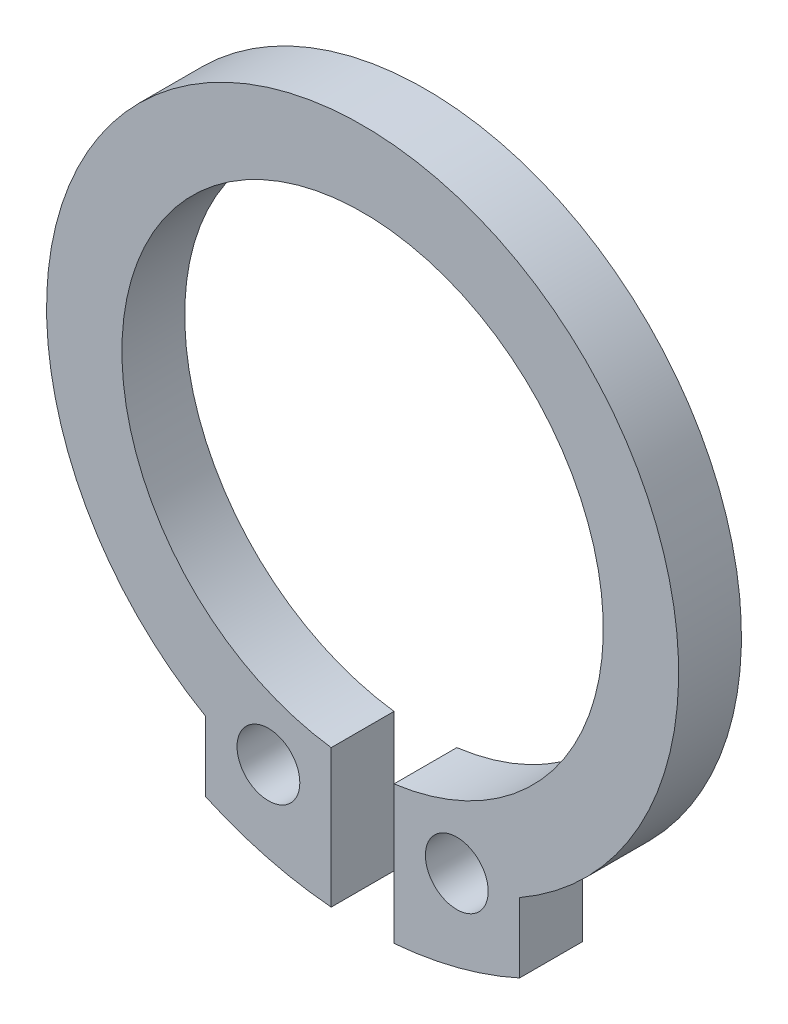
ISO-10303-21;
HEADER;
FILE_DESCRIPTION(('STEP AP214'),'2;1');
FILE_NAME('part.step','',(''),(''),'','','');
FILE_SCHEMA(('AUTOMOTIVE_DESIGN { 1 0 10303 214 1 1 1 1 }'));
ENDSEC;
DATA;
#1=APPLICATION_CONTEXT('core data for automotive mechanical design processes');
#2=APPLICATION_PROTOCOL_DEFINITION('international standard','automotive_design',2000,#1);
#3=PRODUCT_CONTEXT('',#1,'mechanical');
#4=PRODUCT('Part','Part','',(#3));
#5=PRODUCT_RELATED_PRODUCT_CATEGORY('part','',(#4));
#6=PRODUCT_DEFINITION_FORMATION('','',#4);
#7=PRODUCT_DEFINITION_CONTEXT('part definition',#1,'design');
#8=PRODUCT_DEFINITION('design','',#6,#7);
#9=PRODUCT_DEFINITION_SHAPE('','',#8);
#10=(LENGTH_UNIT() NAMED_UNIT(*) SI_UNIT(.MILLI.,.METRE.));
#11=(NAMED_UNIT(*) PLANE_ANGLE_UNIT() SI_UNIT($,.RADIAN.));
#12=(NAMED_UNIT(*) SI_UNIT($,.STERADIAN.) SOLID_ANGLE_UNIT());
#13=UNCERTAINTY_MEASURE_WITH_UNIT(LENGTH_MEASURE(1.E-05),#10,'distance_accuracy_value','');
#14=(GEOMETRIC_REPRESENTATION_CONTEXT(3) GLOBAL_UNCERTAINTY_ASSIGNED_CONTEXT((#13)) GLOBAL_UNIT_ASSIGNED_CONTEXT((#10,
#11,#12)) REPRESENTATION_CONTEXT('',''));
#15=CARTESIAN_POINT('',(0.,0.,0.));
#16=DIRECTION('',(0.,0.,1.));
#17=DIRECTION('',(1.,0.,0.));
#18=AXIS2_PLACEMENT_3D('',#15,#16,#17);
#19=CARTESIAN_POINT('',(0.,0.,0.));
#20=DIRECTION('',(0.,0.,1.));
#21=DIRECTION('',(1.,0.,0.));
#22=AXIS2_PLACEMENT_3D('',#19,#20,#21);
#23=PLANE('',#22);
#24=DIRECTION('',(0.,1.,0.));
#25=VECTOR('',#24,1.);
#26=CARTESIAN_POINT('',(-1.5,0.,0.));
#27=LINE('',#26,#25);
#28=CARTESIAN_POINT('',(-1.5,3.23525928269675E-13,0.));
#29=VERTEX_POINT('',#28);
#30=CARTESIAN_POINT('',(-1.49999999999999,3.30000000000031,0.));
#31=VERTEX_POINT('',#30);
#32=EDGE_CURVE('E114',#29,#31,#27,.T.);
#33=ORIENTED_EDGE('',*,*,#32,.F.);
#34=CARTESIAN_POINT('',(-0.75,9.000877125496,0.));
#35=DIRECTION('',(0.,0.,1.));
#36=DIRECTION('',(1.,0.,0.));
#37=AXIS2_PLACEMENT_3D('',#34,#35,#36);
#38=CIRCLE('',#37,9.03207003008);
#39=CARTESIAN_POINT('',(-4.49999999999996,0.784077929442245,0.));
#40=VERTEX_POINT('',#39);
#41=EDGE_CURVE('E139',#40,#29,#38,.T.);
#42=ORIENTED_EDGE('',*,*,#41,.F.);
#43=DIRECTION('',(0.,1.,0.));
#44=VECTOR('',#43,1.);
#45=CARTESIAN_POINT('',(-4.5,2.448015155333,0.));
#46=LINE('',#45,#44);
#47=CARTESIAN_POINT('',(-4.5,2.44801515533349,0.));
#48=VERTEX_POINT('',#47);
#49=EDGE_CURVE('E117',#48,#40,#46,.F.);
#50=ORIENTED_EDGE('',*,*,#49,.F.);
#51=CARTESIAN_POINT('',(-0.75,9.000877125496,0.));
#52=DIRECTION('',(0.,0.,1.));
#53=DIRECTION('',(1.,0.,0.));
#54=AXIS2_PLACEMENT_3D('',#51,#52,#53);
#55=CIRCLE('',#54,7.55);
#56=CARTESIAN_POINT('',(2.99999999999993,2.44801515533361,0.));
#57=VERTEX_POINT('',#56);
#58=EDGE_CURVE('E98',#57,#48,#55,.T.);
#59=ORIENTED_EDGE('',*,*,#58,.F.);
#60=DIRECTION('',(0.,1.,0.));
#61=VECTOR('',#60,1.);
#62=CARTESIAN_POINT('',(3.,0.7840779294418,0.));
#63=LINE('',#62,#61);
#64=CARTESIAN_POINT('',(3.,0.784077929442146,0.));
#65=VERTEX_POINT('',#64);
#66=EDGE_CURVE('E94',#65,#57,#63,.T.);
#67=ORIENTED_EDGE('',*,*,#66,.F.);
#68=CARTESIAN_POINT('',(-0.75,9.000877125496,0.));
#69=DIRECTION('',(0.,0.,1.));
#70=DIRECTION('',(1.,0.,0.));
#71=AXIS2_PLACEMENT_3D('',#68,#69,#70);
#72=CIRCLE('',#71,9.03207003008);
#73=CARTESIAN_POINT('',(0.,4.31946145518225E-13,0.));
#74=VERTEX_POINT('',#73);
#75=EDGE_CURVE('E83',#74,#65,#72,.T.);
#76=ORIENTED_EDGE('',*,*,#75,.F.);
#77=DIRECTION('',(0.,1.,0.));
#78=VECTOR('',#77,1.);
#79=CARTESIAN_POINT('',(0.,3.3,0.));
#80=LINE('',#79,#78);
#81=CARTESIAN_POINT('',(0.,3.30000000000031,0.));
#82=VERTEX_POINT('',#81);
#83=EDGE_CURVE('E78',#82,#74,#80,.F.);
#84=ORIENTED_EDGE('',*,*,#83,.F.);
#85=CARTESIAN_POINT('',(-0.75,9.000877125496,0.));
#86=DIRECTION('',(0.,0.,1.));
#87=DIRECTION('',(1.,0.,0.));
#88=AXIS2_PLACEMENT_3D('',#85,#86,#87);
#89=CIRCLE('',#88,5.75);
#90=EDGE_CURVE('E136',#82,#31,#89,.T.);
#91=ORIENTED_EDGE('',*,*,#90,.T.);
#92=EDGE_LOOP('',(#33,#42,#50,#59,#67,#76,#84,#91));
#93=FACE_BOUND('',#92,.T.);
#94=CARTESIAN_POINT('',(1.5,2.2,0.));
#95=DIRECTION('',(0.,0.,1.));
#96=DIRECTION('',(1.,0.,0.));
#97=AXIS2_PLACEMENT_3D('',#94,#95,#96);
#98=CIRCLE('',#97,0.75);
#99=CARTESIAN_POINT('',(2.25,2.2,0.));
#100=VERTEX_POINT('',#99);
#101=EDGE_CURVE('E113',#100,#100,#98,.T.);
#102=ORIENTED_EDGE('',*,*,#101,.T.);
#103=EDGE_LOOP('',(#102));
#104=FACE_BOUND('',#103,.T.);
#105=CARTESIAN_POINT('',(-3.,2.2,0.));
#106=DIRECTION('',(0.,0.,1.));
#107=DIRECTION('',(1.,0.,0.));
#108=AXIS2_PLACEMENT_3D('',#105,#106,#107);
#109=CIRCLE('',#108,0.75);
#110=CARTESIAN_POINT('',(-2.25,2.2,0.));
#111=VERTEX_POINT('',#110);
#112=EDGE_CURVE('E20',#111,#111,#109,.T.);
#113=ORIENTED_EDGE('',*,*,#112,.T.);
#114=EDGE_LOOP('',(#113));
#115=FACE_BOUND('',#114,.T.);
#116=ADVANCED_FACE('F17',(#93,#104,#115),#23,.F.);
#117=CARTESIAN_POINT('',(-3.,2.2,-0.15));
#118=DIRECTION('',(0.,0.,1.));
#119=DIRECTION('',(1.,0.,0.));
#120=AXIS2_PLACEMENT_3D('',#117,#118,#119);
#121=CYLINDRICAL_SURFACE('',#120,0.75);
#122=ORIENTED_EDGE('',*,*,#112,.F.);
#123=EDGE_LOOP('',(#122));
#124=FACE_BOUND('',#123,.T.);
#125=CARTESIAN_POINT('',(-3.,2.2,1.5));
#126=DIRECTION('',(0.,0.,1.));
#127=DIRECTION('',(1.,0.,0.));
#128=AXIS2_PLACEMENT_3D('',#125,#126,#127);
#129=CIRCLE('',#128,0.75);
#130=CARTESIAN_POINT('',(-2.25,2.2,1.5));
#131=VERTEX_POINT('',#130);
#132=EDGE_CURVE('E133',#131,#131,#129,.F.);
#133=ORIENTED_EDGE('',*,*,#132,.F.);
#134=EDGE_LOOP('',(#133));
#135=FACE_BOUND('',#134,.T.);
#136=ADVANCED_FACE('F147',(#124,#135),#121,.F.);
#137=CARTESIAN_POINT('',(1.5,2.2,-0.15));
#138=DIRECTION('',(0.,0.,1.));
#139=DIRECTION('',(1.,0.,0.));
#140=AXIS2_PLACEMENT_3D('',#137,#138,#139);
#141=CYLINDRICAL_SURFACE('',#140,0.75);
#142=ORIENTED_EDGE('',*,*,#101,.F.);
#143=EDGE_LOOP('',(#142));
#144=FACE_BOUND('',#143,.T.);
#145=CARTESIAN_POINT('',(1.5,2.2,1.5));
#146=DIRECTION('',(0.,0.,1.));
#147=DIRECTION('',(1.,0.,0.));
#148=AXIS2_PLACEMENT_3D('',#145,#146,#147);
#149=CIRCLE('',#148,0.75);
#150=CARTESIAN_POINT('',(2.25,2.2,1.5));
#151=VERTEX_POINT('',#150);
#152=EDGE_CURVE('E130',#151,#151,#149,.F.);
#153=ORIENTED_EDGE('',*,*,#152,.F.);
#154=EDGE_LOOP('',(#153));
#155=FACE_BOUND('',#154,.T.);
#156=ADVANCED_FACE('F150',(#144,#155),#141,.F.);
#157=CARTESIAN_POINT('',(0.,3.3,0.));
#158=DIRECTION('',(-1.,0.,0.));
#159=DIRECTION('',(0.,0.,1.));
#160=AXIS2_PLACEMENT_3D('',#157,#158,#159);
#161=PLANE('',#160);
#162=DIRECTION('',(0.,0.,1.));
#163=VECTOR('',#162,1.);
#164=CARTESIAN_POINT('',(0.,4.31946145518225E-13,0.));
#165=LINE('',#164,#163);
#166=CARTESIAN_POINT('',(0.,4.31946145518225E-13,1.5));
#167=VERTEX_POINT('',#166);
#168=EDGE_CURVE('E90',#167,#74,#165,.F.);
#169=ORIENTED_EDGE('',*,*,#168,.F.);
#170=DIRECTION('',(0.,1.,0.));
#171=VECTOR('',#170,1.);
#172=CARTESIAN_POINT('',(0.,0.,1.5));
#173=LINE('',#172,#171);
#174=CARTESIAN_POINT('',(0.,3.30000000000031,1.5));
#175=VERTEX_POINT('',#174);
#176=EDGE_CURVE('E129',#175,#167,#173,.F.);
#177=ORIENTED_EDGE('',*,*,#176,.F.);
#178=DIRECTION('',(0.,0.,1.));
#179=VECTOR('',#178,1.);
#180=CARTESIAN_POINT('',(0.,3.30000000000031,0.));
#181=LINE('',#180,#179);
#182=EDGE_CURVE('E138',#175,#82,#181,.F.);
#183=ORIENTED_EDGE('',*,*,#182,.T.);
#184=ORIENTED_EDGE('',*,*,#83,.T.);
#185=EDGE_LOOP('',(#169,#177,#183,#184));
#186=FACE_BOUND('',#185,.T.);
#187=ADVANCED_FACE('F185',(#186),#161,.T.);
#188=CARTESIAN_POINT('',(-0.75,9.000877125496,0.));
#189=DIRECTION('',(0.,0.,1.));
#190=DIRECTION('',(1.,0.,0.));
#191=AXIS2_PLACEMENT_3D('',#188,#189,#190);
#192=CYLINDRICAL_SURFACE('',#191,9.03207003008);
#193=DIRECTION('',(0.,0.,-1.));
#194=VECTOR('',#193,1.);
#195=CARTESIAN_POINT('',(3.,0.784077929442031,0.));
#196=LINE('',#195,#194);
#197=CARTESIAN_POINT('',(3.,0.784077929442146,1.5));
#198=VERTEX_POINT('',#197);
#199=EDGE_CURVE('E88',#198,#65,#196,.T.);
#200=ORIENTED_EDGE('',*,*,#199,.F.);
#201=CARTESIAN_POINT('',(-0.75,9.000877125496,1.5));
#202=DIRECTION('',(0.,0.,1.));
#203=DIRECTION('',(1.,0.,0.));
#204=AXIS2_PLACEMENT_3D('',#201,#202,#203);
#205=CIRCLE('',#204,9.03207003008);
#206=EDGE_CURVE('E127',#167,#198,#205,.T.);
#207=ORIENTED_EDGE('',*,*,#206,.F.);
#208=ORIENTED_EDGE('',*,*,#168,.T.);
#209=ORIENTED_EDGE('',*,*,#75,.T.);
#210=EDGE_LOOP('',(#200,#207,#208,#209));
#211=FACE_BOUND('',#210,.T.);
#212=ADVANCED_FACE('F85',(#211),#192,.T.);
#213=CARTESIAN_POINT('',(3.,0.7840779294418,0.));
#214=DIRECTION('',(1.,0.,0.));
#215=DIRECTION('',(0.,0.,-1.));
#216=AXIS2_PLACEMENT_3D('',#213,#214,#215);
#217=PLANE('',#216);
#218=DIRECTION('',(0.,0.,1.));
#219=VECTOR('',#218,1.);
#220=CARTESIAN_POINT('',(2.99999999999985,2.44801515533356,0.));
#221=LINE('',#220,#219);
#222=CARTESIAN_POINT('',(2.99999999999993,2.44801515533361,1.5));
#223=VERTEX_POINT('',#222);
#224=EDGE_CURVE('E101',#223,#57,#221,.F.);
#225=ORIENTED_EDGE('',*,*,#224,.F.);
#226=DIRECTION('',(0.,1.,0.));
#227=VECTOR('',#226,1.);
#228=CARTESIAN_POINT('',(3.,0.,1.5));
#229=LINE('',#228,#227);
#230=EDGE_CURVE('E105',#198,#223,#229,.T.);
#231=ORIENTED_EDGE('',*,*,#230,.F.);
#232=ORIENTED_EDGE('',*,*,#199,.T.);
#233=ORIENTED_EDGE('',*,*,#66,.T.);
#234=EDGE_LOOP('',(#225,#231,#232,#233));
#235=FACE_BOUND('',#234,.T.);
#236=ADVANCED_FACE('F103',(#235),#217,.T.);
#237=CARTESIAN_POINT('',(-0.75,9.000877125496,0.));
#238=DIRECTION('',(0.,0.,1.));
#239=DIRECTION('',(1.,0.,0.));
#240=AXIS2_PLACEMENT_3D('',#237,#238,#239);
#241=CYLINDRICAL_SURFACE('',#240,7.55);
#242=DIRECTION('',(0.,0.,1.));
#243=VECTOR('',#242,1.);
#244=CARTESIAN_POINT('',(-4.5,2.44801515533332,0.));
#245=LINE('',#244,#243);
#246=CARTESIAN_POINT('',(-4.5,2.44801515533349,1.5));
#247=VERTEX_POINT('',#246);
#248=EDGE_CURVE('E119',#247,#48,#245,.F.);
#249=ORIENTED_EDGE('',*,*,#248,.F.);
#250=CARTESIAN_POINT('',(-0.75,9.000877125496,1.5));
#251=DIRECTION('',(0.,0.,1.));
#252=DIRECTION('',(1.,0.,0.));
#253=AXIS2_PLACEMENT_3D('',#250,#251,#252);
#254=CIRCLE('',#253,7.55);
#255=EDGE_CURVE('E125',#223,#247,#254,.T.);
#256=ORIENTED_EDGE('',*,*,#255,.F.);
#257=ORIENTED_EDGE('',*,*,#224,.T.);
#258=ORIENTED_EDGE('',*,*,#58,.T.);
#259=EDGE_LOOP('',(#249,#256,#257,#258));
#260=FACE_BOUND('',#259,.T.);
#261=ADVANCED_FACE('F176',(#260),#241,.T.);
#262=CARTESIAN_POINT('',(-4.5,2.448015155333,0.));
#263=DIRECTION('',(-1.,0.,0.));
#264=DIRECTION('',(0.,0.,1.));
#265=AXIS2_PLACEMENT_3D('',#262,#263,#264);
#266=PLANE('',#265);
#267=DIRECTION('',(0.,0.,1.));
#268=VECTOR('',#267,1.);
#269=CARTESIAN_POINT('',(-4.49999999999992,0.784077929442226,0.));
#270=LINE('',#269,#268);
#271=CARTESIAN_POINT('',(-4.49999999999996,0.784077929442245,1.5));
#272=VERTEX_POINT('',#271);
#273=EDGE_CURVE('E118',#272,#40,#270,.F.);
#274=ORIENTED_EDGE('',*,*,#273,.F.);
#275=DIRECTION('',(0.,1.,0.));
#276=VECTOR('',#275,1.);
#277=CARTESIAN_POINT('',(-4.5,0.,1.5));
#278=LINE('',#277,#276);
#279=EDGE_CURVE('E124',#247,#272,#278,.F.);
#280=ORIENTED_EDGE('',*,*,#279,.F.);
#281=ORIENTED_EDGE('',*,*,#248,.T.);
#282=ORIENTED_EDGE('',*,*,#49,.T.);
#283=EDGE_LOOP('',(#274,#280,#281,#282));
#284=FACE_BOUND('',#283,.T.);
#285=ADVANCED_FACE('F172',(#284),#266,.T.);
#286=CARTESIAN_POINT('',(-0.75,9.000877125496,0.));
#287=DIRECTION('',(0.,0.,1.));
#288=DIRECTION('',(1.,0.,0.));
#289=AXIS2_PLACEMENT_3D('',#286,#287,#288);
#290=CYLINDRICAL_SURFACE('',#289,9.03207003008);
#291=DIRECTION('',(0.,0.,-1.));
#292=VECTOR('',#291,1.);
#293=CARTESIAN_POINT('',(-1.5,2.15973072759112E-13,0.));
#294=LINE('',#293,#292);
#295=CARTESIAN_POINT('',(-1.5,3.23525928269675E-13,1.5));
#296=VERTEX_POINT('',#295);
#297=EDGE_CURVE('E116',#296,#29,#294,.T.);
#298=ORIENTED_EDGE('',*,*,#297,.F.);
#299=CARTESIAN_POINT('',(-0.75,9.000877125496,1.5));
#300=DIRECTION('',(0.,0.,1.));
#301=DIRECTION('',(1.,0.,0.));
#302=AXIS2_PLACEMENT_3D('',#299,#300,#301);
#303=CIRCLE('',#302,9.03207003008);
#304=EDGE_CURVE('E121',#272,#296,#303,.T.);
#305=ORIENTED_EDGE('',*,*,#304,.F.);
#306=ORIENTED_EDGE('',*,*,#273,.T.);
#307=ORIENTED_EDGE('',*,*,#41,.T.);
#308=EDGE_LOOP('',(#298,#305,#306,#307));
#309=FACE_BOUND('',#308,.T.);
#310=ADVANCED_FACE('F169',(#309),#290,.T.);
#311=CARTESIAN_POINT('',(-1.5,0.,0.));
#312=DIRECTION('',(1.,0.,0.));
#313=DIRECTION('',(0.,0.,-1.));
#314=AXIS2_PLACEMENT_3D('',#311,#312,#313);
#315=PLANE('',#314);
#316=DIRECTION('',(0.,0.,1.));
#317=VECTOR('',#316,1.);
#318=CARTESIAN_POINT('',(-1.49999999999998,3.30000000000031,0.));
#319=LINE('',#318,#317);
#320=CARTESIAN_POINT('',(-1.49999999999999,3.30000000000031,1.5));
#321=VERTEX_POINT('',#320);
#322=EDGE_CURVE('E35',#31,#321,#319,.T.);
#323=ORIENTED_EDGE('',*,*,#322,.T.);
#324=DIRECTION('',(0.,1.,0.));
#325=VECTOR('',#324,1.);
#326=CARTESIAN_POINT('',(-1.5,0.,1.5));
#327=LINE('',#326,#325);
#328=EDGE_CURVE('E26',#296,#321,#327,.T.);
#329=ORIENTED_EDGE('',*,*,#328,.F.);
#330=ORIENTED_EDGE('',*,*,#297,.T.);
#331=ORIENTED_EDGE('',*,*,#32,.T.);
#332=EDGE_LOOP('',(#323,#329,#330,#331));
#333=FACE_BOUND('',#332,.T.);
#334=ADVANCED_FACE('F162',(#333),#315,.T.);
#335=CARTESIAN_POINT('',(-0.75,9.000877125496,0.));
#336=DIRECTION('',(0.,0.,1.));
#337=DIRECTION('',(1.,0.,0.));
#338=AXIS2_PLACEMENT_3D('',#335,#336,#337);
#339=CYLINDRICAL_SURFACE('',#338,5.75);
#340=ORIENTED_EDGE('',*,*,#90,.F.);
#341=ORIENTED_EDGE('',*,*,#182,.F.);
#342=CARTESIAN_POINT('',(-0.75,9.000877125496,1.5));
#343=DIRECTION('',(0.,0.,1.));
#344=DIRECTION('',(1.,0.,0.));
#345=AXIS2_PLACEMENT_3D('',#342,#343,#344);
#346=CIRCLE('',#345,5.75);
#347=EDGE_CURVE('E11',#321,#175,#346,.F.);
#348=ORIENTED_EDGE('',*,*,#347,.F.);
#349=ORIENTED_EDGE('',*,*,#322,.F.);
#350=EDGE_LOOP('',(#340,#341,#348,#349));
#351=FACE_BOUND('',#350,.T.);
#352=ADVANCED_FACE('F155',(#351),#339,.F.);
#353=CARTESIAN_POINT('',(0.,0.,1.5));
#354=DIRECTION('',(0.,0.,1.));
#355=DIRECTION('',(1.,0.,0.));
#356=AXIS2_PLACEMENT_3D('',#353,#354,#355);
#357=PLANE('',#356);
#358=ORIENTED_EDGE('',*,*,#347,.T.);
#359=ORIENTED_EDGE('',*,*,#176,.T.);
#360=ORIENTED_EDGE('',*,*,#206,.T.);
#361=ORIENTED_EDGE('',*,*,#230,.T.);
#362=ORIENTED_EDGE('',*,*,#255,.T.);
#363=ORIENTED_EDGE('',*,*,#279,.T.);
#364=ORIENTED_EDGE('',*,*,#304,.T.);
#365=ORIENTED_EDGE('',*,*,#328,.T.);
#366=EDGE_LOOP('',(#358,#359,#360,#361,#362,#363,#364,#365));
#367=FACE_BOUND('',#366,.T.);
#368=ORIENTED_EDGE('',*,*,#152,.T.);
#369=EDGE_LOOP('',(#368));
#370=FACE_BOUND('',#369,.T.);
#371=ORIENTED_EDGE('',*,*,#132,.T.);
#372=EDGE_LOOP('',(#371));
#373=FACE_BOUND('',#372,.T.);
#374=ADVANCED_FACE('F153',(#367,#370,#373),#357,.T.);
#375=CLOSED_SHELL('',(#116,#136,#156,#187,#212,#236,#261,#285,#310,#334,#352,#374));
#376=MANIFOLD_SOLID_BREP('B1',#375);
#377=ADVANCED_BREP_SHAPE_REPRESENTATION('',(#18,#376),#14);
#378=SHAPE_DEFINITION_REPRESENTATION(#9,#377);
ENDSEC;
END-ISO-10303-21;
